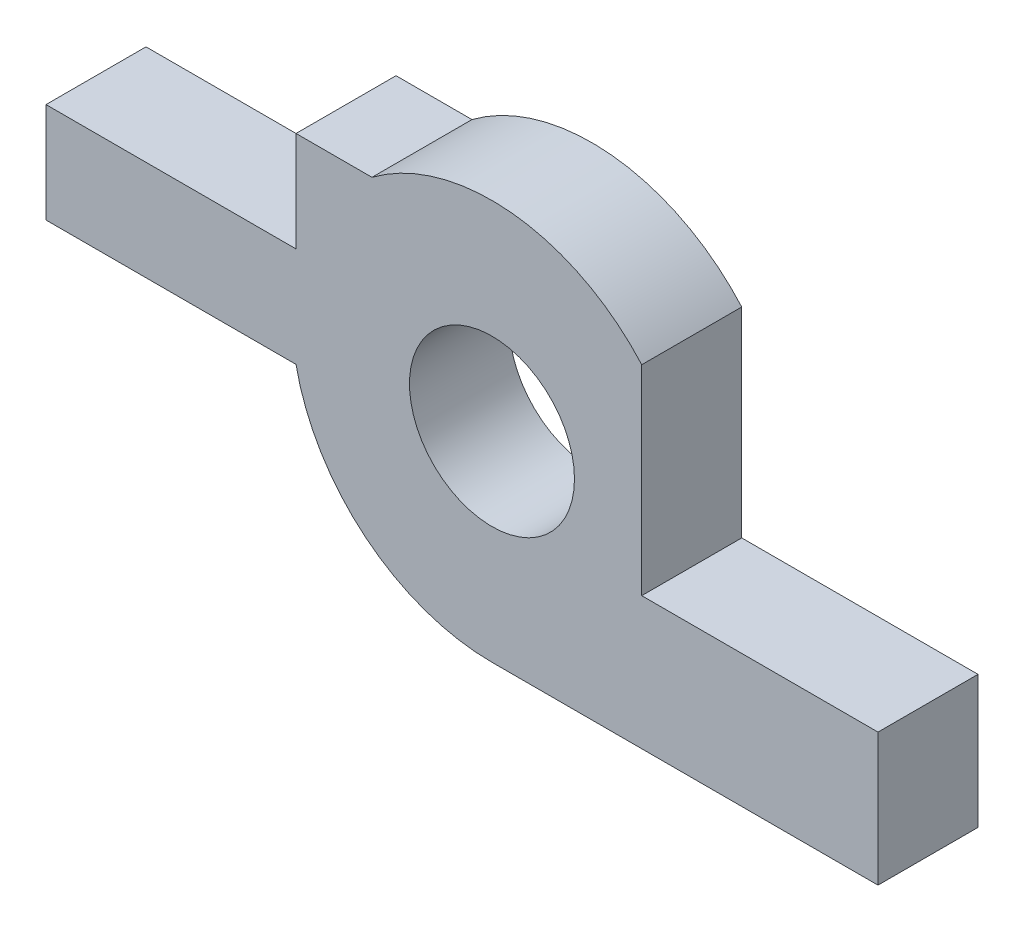
ISO-10303-21;
HEADER;
FILE_DESCRIPTION(('STEP AP214'),'2;1');
FILE_NAME('part.step','',(''),(''),'','','');
FILE_SCHEMA(('AUTOMOTIVE_DESIGN { 1 0 10303 214 1 1 1 1 }'));
ENDSEC;
DATA;
#1=APPLICATION_CONTEXT('core data for automotive mechanical design processes');
#2=APPLICATION_PROTOCOL_DEFINITION('international standard','automotive_design',2000,#1);
#3=PRODUCT_CONTEXT('',#1,'mechanical');
#4=PRODUCT('Part','Part','',(#3));
#5=PRODUCT_RELATED_PRODUCT_CATEGORY('part','',(#4));
#6=PRODUCT_DEFINITION_FORMATION('','',#4);
#7=PRODUCT_DEFINITION_CONTEXT('part definition',#1,'design');
#8=PRODUCT_DEFINITION('design','',#6,#7);
#9=PRODUCT_DEFINITION_SHAPE('','',#8);
#10=(LENGTH_UNIT() NAMED_UNIT(*) SI_UNIT(.MILLI.,.METRE.));
#11=(NAMED_UNIT(*) PLANE_ANGLE_UNIT() SI_UNIT($,.RADIAN.));
#12=(NAMED_UNIT(*) SI_UNIT($,.STERADIAN.) SOLID_ANGLE_UNIT());
#13=UNCERTAINTY_MEASURE_WITH_UNIT(LENGTH_MEASURE(1.E-05),#10,'distance_accuracy_value','');
#14=(GEOMETRIC_REPRESENTATION_CONTEXT(3) GLOBAL_UNCERTAINTY_ASSIGNED_CONTEXT((#13)) GLOBAL_UNIT_ASSIGNED_CONTEXT((#10,
#11,#12)) REPRESENTATION_CONTEXT('',''));
#15=CARTESIAN_POINT('',(0.,0.,0.));
#16=DIRECTION('',(0.,0.,1.));
#17=DIRECTION('',(1.,0.,0.));
#18=AXIS2_PLACEMENT_3D('',#15,#16,#17);
#19=CARTESIAN_POINT('',(0.,0.,2.));
#20=DIRECTION('',(0.,0.,1.));
#21=DIRECTION('',(1.,0.,0.));
#22=AXIS2_PLACEMENT_3D('',#19,#20,#21);
#23=PLANE('',#22);
#24=CARTESIAN_POINT('',(0.,0.,2.));
#25=DIRECTION('',(0.,0.,1.));
#26=DIRECTION('',(1.,0.,0.));
#27=AXIS2_PLACEMENT_3D('',#24,#25,#26);
#28=CIRCLE('',#27,4.);
#29=CARTESIAN_POINT('',(-3.91918358845309,-0.8,2.));
#30=VERTEX_POINT('',#29);
#31=CARTESIAN_POINT('',(0.,-4.,2.));
#32=VERTEX_POINT('',#31);
#33=EDGE_CURVE('E169',#30,#32,#28,.T.);
#34=ORIENTED_EDGE('',*,*,#33,.T.);
#35=DIRECTION('',(1.,0.,0.));
#36=VECTOR('',#35,1.);
#37=CARTESIAN_POINT('',(7.72000000000002,-4.,2.));
#38=LINE('',#37,#36);
#39=CARTESIAN_POINT('',(7.72000000000002,-4.,2.));
#40=VERTEX_POINT('',#39);
#41=EDGE_CURVE('E102',#32,#40,#38,.T.);
#42=ORIENTED_EDGE('',*,*,#41,.T.);
#43=DIRECTION('',(0.,1.,0.));
#44=VECTOR('',#43,1.);
#45=CARTESIAN_POINT('',(7.72,-1.34852681521862,2.));
#46=LINE('',#45,#44);
#47=CARTESIAN_POINT('',(7.72,-1.34852681521862,2.));
#48=VERTEX_POINT('',#47);
#49=EDGE_CURVE('E193',#40,#48,#46,.T.);
#50=ORIENTED_EDGE('',*,*,#49,.T.);
#51=DIRECTION('',(-1.,0.,0.));
#52=VECTOR('',#51,1.);
#53=CARTESIAN_POINT('',(2.99494406465051,-1.34852681521862,2.));
#54=LINE('',#53,#52);
#55=CARTESIAN_POINT('',(2.99494406465051,-1.34852681521862,2.));
#56=VERTEX_POINT('',#55);
#57=EDGE_CURVE('E212',#48,#56,#54,.T.);
#58=ORIENTED_EDGE('',*,*,#57,.T.);
#59=DIRECTION('',(0.,1.,0.));
#60=VECTOR('',#59,1.);
#61=CARTESIAN_POINT('',(2.99494406465051,2.65147318478138,2.));
#62=LINE('',#61,#60);
#63=CARTESIAN_POINT('',(2.99494406465051,2.65147318478138,2.));
#64=VERTEX_POINT('',#63);
#65=EDGE_CURVE('E209',#56,#64,#62,.T.);
#66=ORIENTED_EDGE('',*,*,#65,.T.);
#67=CARTESIAN_POINT('',(0.,0.,2.));
#68=DIRECTION('',(0.,0.,1.));
#69=DIRECTION('',(1.,0.,0.));
#70=AXIS2_PLACEMENT_3D('',#67,#68,#69);
#71=CIRCLE('',#70,4.);
#72=CARTESIAN_POINT('',(-2.40000000000001,3.2,2.));
#73=VERTEX_POINT('',#72);
#74=EDGE_CURVE('E211',#64,#73,#71,.T.);
#75=ORIENTED_EDGE('',*,*,#74,.T.);
#76=DIRECTION('',(-1.,0.,0.));
#77=VECTOR('',#76,1.);
#78=CARTESIAN_POINT('',(-3.91918358845309,3.2,2.));
#79=LINE('',#78,#77);
#80=CARTESIAN_POINT('',(-3.91918358845309,3.2,2.));
#81=VERTEX_POINT('',#80);
#82=EDGE_CURVE('E214',#73,#81,#79,.T.);
#83=ORIENTED_EDGE('',*,*,#82,.T.);
#84=DIRECTION('',(0.,-1.,0.));
#85=VECTOR('',#84,1.);
#86=CARTESIAN_POINT('',(-3.91918358845309,1.2,2.));
#87=LINE('',#86,#85);
#88=CARTESIAN_POINT('',(-3.91918358845309,1.2,2.));
#89=VERTEX_POINT('',#88);
#90=EDGE_CURVE('E130',#81,#89,#87,.T.);
#91=ORIENTED_EDGE('',*,*,#90,.T.);
#92=DIRECTION('',(-1.,0.,0.));
#93=VECTOR('',#92,1.);
#94=CARTESIAN_POINT('',(-3.91918358845309,1.2,2.));
#95=LINE('',#94,#93);
#96=CARTESIAN_POINT('',(-8.91918358845309,1.2,2.));
#97=VERTEX_POINT('',#96);
#98=EDGE_CURVE('E124',#89,#97,#95,.T.);
#99=ORIENTED_EDGE('',*,*,#98,.T.);
#100=DIRECTION('',(0.,-1.,0.));
#101=VECTOR('',#100,1.);
#102=CARTESIAN_POINT('',(-8.91918358845309,1.2,2.));
#103=LINE('',#102,#101);
#104=CARTESIAN_POINT('',(-8.91918358845305,-0.799999999999993,2.));
#105=VERTEX_POINT('',#104);
#106=EDGE_CURVE('E128',#97,#105,#103,.T.);
#107=ORIENTED_EDGE('',*,*,#106,.T.);
#108=DIRECTION('',(1.,0.,0.));
#109=VECTOR('',#108,1.);
#110=CARTESIAN_POINT('',(-3.91918358845309,-0.8,2.));
#111=LINE('',#110,#109);
#112=EDGE_CURVE('E50',#105,#30,#111,.T.);
#113=ORIENTED_EDGE('',*,*,#112,.T.);
#114=EDGE_LOOP('',(#34,#42,#50,#58,#66,#75,#83,#91,#99,#107,#113));
#115=FACE_BOUND('',#114,.T.);
#116=CARTESIAN_POINT('',(0.,0.,2.));
#117=DIRECTION('',(0.,0.,1.));
#118=DIRECTION('',(1.,0.,0.));
#119=AXIS2_PLACEMENT_3D('',#116,#117,#118);
#120=CIRCLE('',#119,1.65);
#121=CARTESIAN_POINT('',(1.65,0.,2.));
#122=VERTEX_POINT('',#121);
#123=EDGE_CURVE('E152',#122,#122,#120,.T.);
#124=ORIENTED_EDGE('',*,*,#123,.F.);
#125=EDGE_LOOP('',(#124));
#126=FACE_BOUND('',#125,.T.);
#127=ADVANCED_FACE('F33',(#115,#126),#23,.T.);
#128=CARTESIAN_POINT('',(0.,0.,0.));
#129=DIRECTION('',(0.,0.,1.));
#130=DIRECTION('',(1.,0.,0.));
#131=AXIS2_PLACEMENT_3D('',#128,#129,#130);
#132=PLANE('',#131);
#133=CARTESIAN_POINT('',(0.,0.,0.));
#134=DIRECTION('',(0.,0.,1.));
#135=DIRECTION('',(1.,0.,0.));
#136=AXIS2_PLACEMENT_3D('',#133,#134,#135);
#137=CIRCLE('',#136,4.);
#138=CARTESIAN_POINT('',(-3.91918358845309,-0.8,0.));
#139=VERTEX_POINT('',#138);
#140=CARTESIAN_POINT('',(0.,-4.,0.));
#141=VERTEX_POINT('',#140);
#142=EDGE_CURVE('E148',#139,#141,#137,.T.);
#143=ORIENTED_EDGE('',*,*,#142,.F.);
#144=DIRECTION('',(1.,0.,0.));
#145=VECTOR('',#144,1.);
#146=CARTESIAN_POINT('',(-3.91918358845309,-0.8,0.));
#147=LINE('',#146,#145);
#148=CARTESIAN_POINT('',(-8.91918358845305,-0.799999999999993,0.));
#149=VERTEX_POINT('',#148);
#150=EDGE_CURVE('E94',#149,#139,#147,.T.);
#151=ORIENTED_EDGE('',*,*,#150,.F.);
#152=DIRECTION('',(0.,-1.,0.));
#153=VECTOR('',#152,1.);
#154=CARTESIAN_POINT('',(-8.91918358845309,1.2,0.));
#155=LINE('',#154,#153);
#156=CARTESIAN_POINT('',(-8.91918358845309,1.2,0.));
#157=VERTEX_POINT('',#156);
#158=EDGE_CURVE('E88',#157,#149,#155,.T.);
#159=ORIENTED_EDGE('',*,*,#158,.F.);
#160=DIRECTION('',(-1.,0.,0.));
#161=VECTOR('',#160,1.);
#162=CARTESIAN_POINT('',(-3.91918358845309,1.2,0.));
#163=LINE('',#162,#161);
#164=CARTESIAN_POINT('',(-3.91918358845309,1.2,0.));
#165=VERTEX_POINT('',#164);
#166=EDGE_CURVE('E138',#165,#157,#163,.T.);
#167=ORIENTED_EDGE('',*,*,#166,.F.);
#168=DIRECTION('',(0.,-1.,0.));
#169=VECTOR('',#168,1.);
#170=CARTESIAN_POINT('',(-3.91918358845309,1.2,0.));
#171=LINE('',#170,#169);
#172=CARTESIAN_POINT('',(-3.91918358845309,3.2,0.));
#173=VERTEX_POINT('',#172);
#174=EDGE_CURVE('E164',#173,#165,#171,.T.);
#175=ORIENTED_EDGE('',*,*,#174,.F.);
#176=DIRECTION('',(-1.,0.,0.));
#177=VECTOR('',#176,1.);
#178=CARTESIAN_POINT('',(-3.91918358845309,3.2,0.));
#179=LINE('',#178,#177);
#180=CARTESIAN_POINT('',(-2.40000000000001,3.2,0.));
#181=VERTEX_POINT('',#180);
#182=EDGE_CURVE('E162',#181,#173,#179,.T.);
#183=ORIENTED_EDGE('',*,*,#182,.F.);
#184=CARTESIAN_POINT('',(0.,0.,0.));
#185=DIRECTION('',(0.,0.,1.));
#186=DIRECTION('',(1.,0.,0.));
#187=AXIS2_PLACEMENT_3D('',#184,#185,#186);
#188=CIRCLE('',#187,4.);
#189=CARTESIAN_POINT('',(2.99494406465051,2.65147318478138,0.));
#190=VERTEX_POINT('',#189);
#191=EDGE_CURVE('E160',#190,#181,#188,.T.);
#192=ORIENTED_EDGE('',*,*,#191,.F.);
#193=DIRECTION('',(0.,1.,0.));
#194=VECTOR('',#193,1.);
#195=CARTESIAN_POINT('',(2.99494406465051,2.65147318478138,0.));
#196=LINE('',#195,#194);
#197=CARTESIAN_POINT('',(2.99494406465051,-1.34852681521862,0.));
#198=VERTEX_POINT('',#197);
#199=EDGE_CURVE('E158',#198,#190,#196,.T.);
#200=ORIENTED_EDGE('',*,*,#199,.F.);
#201=DIRECTION('',(-1.,0.,0.));
#202=VECTOR('',#201,1.);
#203=CARTESIAN_POINT('',(2.99494406465051,-1.34852681521862,0.));
#204=LINE('',#203,#202);
#205=CARTESIAN_POINT('',(7.72,-1.34852681521862,0.));
#206=VERTEX_POINT('',#205);
#207=EDGE_CURVE('E156',#206,#198,#204,.T.);
#208=ORIENTED_EDGE('',*,*,#207,.F.);
#209=DIRECTION('',(0.,1.,0.));
#210=VECTOR('',#209,1.);
#211=CARTESIAN_POINT('',(7.72,-1.34852681521862,0.));
#212=LINE('',#211,#210);
#213=CARTESIAN_POINT('',(7.72000000000002,-4.,0.));
#214=VERTEX_POINT('',#213);
#215=EDGE_CURVE('E154',#214,#206,#212,.T.);
#216=ORIENTED_EDGE('',*,*,#215,.F.);
#217=DIRECTION('',(1.,0.,0.));
#218=VECTOR('',#217,1.);
#219=CARTESIAN_POINT('',(7.72000000000002,-4.,0.));
#220=LINE('',#219,#218);
#221=EDGE_CURVE('E151',#141,#214,#220,.T.);
#222=ORIENTED_EDGE('',*,*,#221,.F.);
#223=EDGE_LOOP('',(#143,#151,#159,#167,#175,#183,#192,#200,#208,#216,#222));
#224=FACE_BOUND('',#223,.T.);
#225=CARTESIAN_POINT('',(0.,0.,0.));
#226=DIRECTION('',(0.,0.,1.));
#227=DIRECTION('',(1.,0.,0.));
#228=AXIS2_PLACEMENT_3D('',#225,#226,#227);
#229=CIRCLE('',#228,1.65);
#230=CARTESIAN_POINT('',(1.65,0.,0.));
#231=VERTEX_POINT('',#230);
#232=EDGE_CURVE('E352',#231,#231,#229,.T.);
#233=ORIENTED_EDGE('',*,*,#232,.T.);
#234=EDGE_LOOP('',(#233));
#235=FACE_BOUND('',#234,.T.);
#236=ADVANCED_FACE('F197',(#224,#235),#132,.F.);
#237=CARTESIAN_POINT('',(0.,0.,2.));
#238=DIRECTION('',(0.,0.,-1.));
#239=DIRECTION('',(-1.,0.,0.));
#240=AXIS2_PLACEMENT_3D('',#237,#238,#239);
#241=CYLINDRICAL_SURFACE('',#240,4.);
#242=ORIENTED_EDGE('',*,*,#142,.T.);
#243=DIRECTION('',(0.,0.,-1.));
#244=VECTOR('',#243,1.);
#245=CARTESIAN_POINT('',(0.,-4.,2.));
#246=LINE('',#245,#244);
#247=EDGE_CURVE('E11',#32,#141,#246,.T.);
#248=ORIENTED_EDGE('',*,*,#247,.F.);
#249=ORIENTED_EDGE('',*,*,#33,.F.);
#250=DIRECTION('',(0.,0.,-1.));
#251=VECTOR('',#250,1.);
#252=CARTESIAN_POINT('',(-3.91918358845309,-0.8,2.));
#253=LINE('',#252,#251);
#254=EDGE_CURVE('E144',#30,#139,#253,.T.);
#255=ORIENTED_EDGE('',*,*,#254,.T.);
#256=EDGE_LOOP('',(#242,#248,#249,#255));
#257=FACE_BOUND('',#256,.T.);
#258=ADVANCED_FACE('F35',(#257),#241,.T.);
#259=CARTESIAN_POINT('',(7.72000000000002,-4.,2.));
#260=DIRECTION('',(0.,1.,0.));
#261=DIRECTION('',(0.,0.,1.));
#262=AXIS2_PLACEMENT_3D('',#259,#260,#261);
#263=PLANE('',#262);
#264=ORIENTED_EDGE('',*,*,#221,.T.);
#265=DIRECTION('',(0.,0.,-1.));
#266=VECTOR('',#265,1.);
#267=CARTESIAN_POINT('',(7.72000000000002,-4.,2.));
#268=LINE('',#267,#266);
#269=EDGE_CURVE('E42',#40,#214,#268,.T.);
#270=ORIENTED_EDGE('',*,*,#269,.F.);
#271=ORIENTED_EDGE('',*,*,#41,.F.);
#272=ORIENTED_EDGE('',*,*,#247,.T.);
#273=EDGE_LOOP('',(#264,#270,#271,#272));
#274=FACE_BOUND('',#273,.T.);
#275=ADVANCED_FACE('F251',(#274),#263,.F.);
#276=CARTESIAN_POINT('',(7.72,-1.34852681521862,2.));
#277=DIRECTION('',(-1.,0.,0.));
#278=DIRECTION('',(0.,-1.,0.));
#279=AXIS2_PLACEMENT_3D('',#276,#277,#278);
#280=PLANE('',#279);
#281=ORIENTED_EDGE('',*,*,#215,.T.);
#282=DIRECTION('',(0.,0.,-1.));
#283=VECTOR('',#282,1.);
#284=CARTESIAN_POINT('',(7.72,-1.34852681521862,2.));
#285=LINE('',#284,#283);
#286=EDGE_CURVE('E185',#48,#206,#285,.T.);
#287=ORIENTED_EDGE('',*,*,#286,.F.);
#288=ORIENTED_EDGE('',*,*,#49,.F.);
#289=ORIENTED_EDGE('',*,*,#269,.T.);
#290=EDGE_LOOP('',(#281,#287,#288,#289));
#291=FACE_BOUND('',#290,.T.);
#292=ADVANCED_FACE('F191',(#291),#280,.F.);
#293=CARTESIAN_POINT('',(2.99494406465051,-1.34852681521862,2.));
#294=DIRECTION('',(0.,-1.,0.));
#295=DIRECTION('',(1.,0.,0.));
#296=AXIS2_PLACEMENT_3D('',#293,#294,#295);
#297=PLANE('',#296);
#298=ORIENTED_EDGE('',*,*,#207,.T.);
#299=DIRECTION('',(0.,0.,-1.));
#300=VECTOR('',#299,1.);
#301=CARTESIAN_POINT('',(2.99494406465051,-1.34852681521862,2.));
#302=LINE('',#301,#300);
#303=EDGE_CURVE('E182',#56,#198,#302,.T.);
#304=ORIENTED_EDGE('',*,*,#303,.F.);
#305=ORIENTED_EDGE('',*,*,#57,.F.);
#306=ORIENTED_EDGE('',*,*,#286,.T.);
#307=EDGE_LOOP('',(#298,#304,#305,#306));
#308=FACE_BOUND('',#307,.T.);
#309=ADVANCED_FACE('F203',(#308),#297,.F.);
#310=CARTESIAN_POINT('',(2.99494406465051,2.65147318478138,2.));
#311=DIRECTION('',(-1.,0.,0.));
#312=DIRECTION('',(0.,-1.,0.));
#313=AXIS2_PLACEMENT_3D('',#310,#311,#312);
#314=PLANE('',#313);
#315=ORIENTED_EDGE('',*,*,#199,.T.);
#316=DIRECTION('',(0.,0.,-1.));
#317=VECTOR('',#316,1.);
#318=CARTESIAN_POINT('',(2.99494406465051,2.65147318478138,2.));
#319=LINE('',#318,#317);
#320=EDGE_CURVE('E179',#64,#190,#319,.T.);
#321=ORIENTED_EDGE('',*,*,#320,.F.);
#322=ORIENTED_EDGE('',*,*,#65,.F.);
#323=ORIENTED_EDGE('',*,*,#303,.T.);
#324=EDGE_LOOP('',(#315,#321,#322,#323));
#325=FACE_BOUND('',#324,.T.);
#326=ADVANCED_FACE('F207',(#325),#314,.F.);
#327=CARTESIAN_POINT('',(0.,0.,2.));
#328=DIRECTION('',(0.,0.,-1.));
#329=DIRECTION('',(-1.,0.,0.));
#330=AXIS2_PLACEMENT_3D('',#327,#328,#329);
#331=CYLINDRICAL_SURFACE('',#330,4.);
#332=ORIENTED_EDGE('',*,*,#191,.T.);
#333=DIRECTION('',(0.,0.,-1.));
#334=VECTOR('',#333,1.);
#335=CARTESIAN_POINT('',(-2.40000000000001,3.2,2.));
#336=LINE('',#335,#334);
#337=EDGE_CURVE('E176',#73,#181,#336,.T.);
#338=ORIENTED_EDGE('',*,*,#337,.F.);
#339=ORIENTED_EDGE('',*,*,#74,.F.);
#340=ORIENTED_EDGE('',*,*,#320,.T.);
#341=EDGE_LOOP('',(#332,#338,#339,#340));
#342=FACE_BOUND('',#341,.T.);
#343=ADVANCED_FACE('F264',(#342),#331,.T.);
#344=CARTESIAN_POINT('',(-3.91918358845309,3.2,2.));
#345=DIRECTION('',(0.,-1.,0.));
#346=DIRECTION('',(0.,0.,-1.));
#347=AXIS2_PLACEMENT_3D('',#344,#345,#346);
#348=PLANE('',#347);
#349=ORIENTED_EDGE('',*,*,#182,.T.);
#350=DIRECTION('',(0.,0.,-1.));
#351=VECTOR('',#350,1.);
#352=CARTESIAN_POINT('',(-3.91918358845309,3.2,2.));
#353=LINE('',#352,#351);
#354=EDGE_CURVE('E173',#81,#173,#353,.T.);
#355=ORIENTED_EDGE('',*,*,#354,.F.);
#356=ORIENTED_EDGE('',*,*,#82,.F.);
#357=ORIENTED_EDGE('',*,*,#337,.T.);
#358=EDGE_LOOP('',(#349,#355,#356,#357));
#359=FACE_BOUND('',#358,.T.);
#360=ADVANCED_FACE('F223',(#359),#348,.F.);
#361=CARTESIAN_POINT('',(-3.91918358845309,1.2,2.));
#362=DIRECTION('',(1.,0.,0.));
#363=DIRECTION('',(0.,0.,-1.));
#364=AXIS2_PLACEMENT_3D('',#361,#362,#363);
#365=PLANE('',#364);
#366=ORIENTED_EDGE('',*,*,#174,.T.);
#367=DIRECTION('',(0.,0.,-1.));
#368=VECTOR('',#367,1.);
#369=CARTESIAN_POINT('',(-3.91918358845309,1.2,2.));
#370=LINE('',#369,#368);
#371=EDGE_CURVE('E139',#89,#165,#370,.T.);
#372=ORIENTED_EDGE('',*,*,#371,.F.);
#373=ORIENTED_EDGE('',*,*,#90,.F.);
#374=ORIENTED_EDGE('',*,*,#354,.T.);
#375=EDGE_LOOP('',(#366,#372,#373,#374));
#376=FACE_BOUND('',#375,.T.);
#377=ADVANCED_FACE('F227',(#376),#365,.F.);
#378=CARTESIAN_POINT('',(-3.91918358845309,1.2,2.));
#379=DIRECTION('',(0.,-1.,0.));
#380=DIRECTION('',(1.,0.,0.));
#381=AXIS2_PLACEMENT_3D('',#378,#379,#380);
#382=PLANE('',#381);
#383=ORIENTED_EDGE('',*,*,#166,.T.);
#384=DIRECTION('',(0.,0.,-1.));
#385=VECTOR('',#384,1.);
#386=CARTESIAN_POINT('',(-8.91918358845309,1.2,2.));
#387=LINE('',#386,#385);
#388=EDGE_CURVE('E135',#97,#157,#387,.T.);
#389=ORIENTED_EDGE('',*,*,#388,.F.);
#390=ORIENTED_EDGE('',*,*,#98,.F.);
#391=ORIENTED_EDGE('',*,*,#371,.T.);
#392=EDGE_LOOP('',(#383,#389,#390,#391));
#393=FACE_BOUND('',#392,.T.);
#394=ADVANCED_FACE('F136',(#393),#382,.F.);
#395=CARTESIAN_POINT('',(-8.91918358845309,1.2,2.));
#396=DIRECTION('',(1.,0.,0.));
#397=DIRECTION('',(0.,1.,0.));
#398=AXIS2_PLACEMENT_3D('',#395,#396,#397);
#399=PLANE('',#398);
#400=ORIENTED_EDGE('',*,*,#158,.T.);
#401=DIRECTION('',(0.,0.,-1.));
#402=VECTOR('',#401,1.);
#403=CARTESIAN_POINT('',(-8.91918358845305,-0.799999999999993,2.));
#404=LINE('',#403,#402);
#405=EDGE_CURVE('E140',#105,#149,#404,.T.);
#406=ORIENTED_EDGE('',*,*,#405,.F.);
#407=ORIENTED_EDGE('',*,*,#106,.F.);
#408=ORIENTED_EDGE('',*,*,#388,.T.);
#409=EDGE_LOOP('',(#400,#406,#407,#408));
#410=FACE_BOUND('',#409,.T.);
#411=ADVANCED_FACE('F142',(#410),#399,.F.);
#412=CARTESIAN_POINT('',(-3.91918358845309,-0.8,2.));
#413=DIRECTION('',(0.,1.,0.));
#414=DIRECTION('',(-1.,0.,0.));
#415=AXIS2_PLACEMENT_3D('',#412,#413,#414);
#416=PLANE('',#415);
#417=ORIENTED_EDGE('',*,*,#150,.T.);
#418=ORIENTED_EDGE('',*,*,#254,.F.);
#419=ORIENTED_EDGE('',*,*,#112,.F.);
#420=ORIENTED_EDGE('',*,*,#405,.T.);
#421=EDGE_LOOP('',(#417,#418,#419,#420));
#422=FACE_BOUND('',#421,.T.);
#423=ADVANCED_FACE('F231',(#422),#416,.F.);
#424=CARTESIAN_POINT('',(0.,0.,2.));
#425=DIRECTION('',(0.,0.,-1.));
#426=DIRECTION('',(-1.,0.,0.));
#427=AXIS2_PLACEMENT_3D('',#424,#425,#426);
#428=CYLINDRICAL_SURFACE('',#427,1.65);
#429=ORIENTED_EDGE('',*,*,#123,.T.);
#430=EDGE_LOOP('',(#429));
#431=FACE_BOUND('',#430,.T.);
#432=ORIENTED_EDGE('',*,*,#232,.F.);
#433=EDGE_LOOP('',(#432));
#434=FACE_BOUND('',#433,.T.);
#435=ADVANCED_FACE('F233',(#431,#434),#428,.F.);
#436=CLOSED_SHELL('',(#127,#236,#258,#275,#292,#309,#326,#343,#360,#377,#394,#411,#423,#435));
#437=MANIFOLD_SOLID_BREP('B2',#436);
#438=ADVANCED_BREP_SHAPE_REPRESENTATION('',(#18,#437),#14);
#439=SHAPE_DEFINITION_REPRESENTATION(#9,#438);
ENDSEC;
END-ISO-10303-21;
